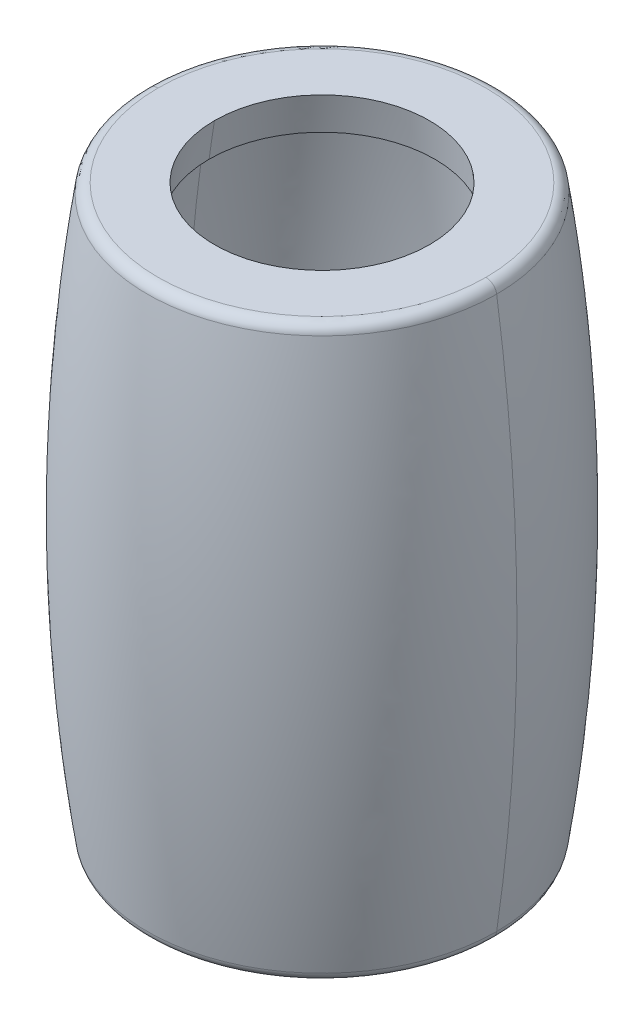
ISO-10303-21;
HEADER;
FILE_DESCRIPTION(('STEP AP214'),'2;1');
FILE_NAME('part.step','',(''),(''),'','','');
FILE_SCHEMA(('AUTOMOTIVE_DESIGN { 1 0 10303 214 1 1 1 1 }'));
ENDSEC;
DATA;
#1=APPLICATION_CONTEXT('core data for automotive mechanical design processes');
#2=APPLICATION_PROTOCOL_DEFINITION('international standard','automotive_design',2000,#1);
#3=PRODUCT_CONTEXT('',#1,'mechanical');
#4=PRODUCT('Part','Part','',(#3));
#5=PRODUCT_RELATED_PRODUCT_CATEGORY('part','',(#4));
#6=PRODUCT_DEFINITION_FORMATION('','',#4);
#7=PRODUCT_DEFINITION_CONTEXT('part definition',#1,'design');
#8=PRODUCT_DEFINITION('design','',#6,#7);
#9=PRODUCT_DEFINITION_SHAPE('','',#8);
#10=(LENGTH_UNIT() NAMED_UNIT(*) SI_UNIT(.MILLI.,.METRE.));
#11=(NAMED_UNIT(*) PLANE_ANGLE_UNIT() SI_UNIT($,.RADIAN.));
#12=(NAMED_UNIT(*) SI_UNIT($,.STERADIAN.) SOLID_ANGLE_UNIT());
#13=UNCERTAINTY_MEASURE_WITH_UNIT(LENGTH_MEASURE(1.E-05),#10,'distance_accuracy_value','');
#14=(GEOMETRIC_REPRESENTATION_CONTEXT(3) GLOBAL_UNCERTAINTY_ASSIGNED_CONTEXT((#13)) GLOBAL_UNIT_ASSIGNED_CONTEXT((#10,
#11,#12)) REPRESENTATION_CONTEXT('',''));
#15=CARTESIAN_POINT('',(0.,0.,0.));
#16=DIRECTION('',(0.,0.,1.));
#17=DIRECTION('',(1.,0.,0.));
#18=AXIS2_PLACEMENT_3D('',#15,#16,#17);
#19=CARTESIAN_POINT('',(0.,-7.6,0.));
#20=DIRECTION('',(0.,-1.,0.));
#21=DIRECTION('',(0.999968235354616,0.,0.00797046308416912));
#22=AXIS2_PLACEMENT_3D('',#19,#20,#21);
#23=TOROIDAL_SURFACE('',#22,4.541707833911,0.3);
#24=CARTESIAN_POINT('',(4.541707833911,-7.6,2.91760365867E-12));
#25=DIRECTION('',(6.42402797623713E-13,0.,-1.));
#26=DIRECTION('',(0.989265332489849,-0.146130427816207,6.35506817183632E-13));
#27=AXIS2_PLACEMENT_3D('',#24,#25,#26);
#28=CIRCLE('',#27,0.3);
#29=CARTESIAN_POINT('',(4.838487428818,-7.643839161107,0.));
#30=VERTEX_POINT('',#29);
#31=CARTESIAN_POINT('',(4.541707637682,-7.9,0.));
#32=VERTEX_POINT('',#31);
#33=EDGE_CURVE('E11',#30,#32,#28,.T.);
#34=ORIENTED_EDGE('',*,*,#33,.T.);
#35=CARTESIAN_POINT('',(0.,-7.9,0.));
#36=DIRECTION('',(0.,1.,0.));
#37=DIRECTION('',(1.,0.,0.));
#38=AXIS2_PLACEMENT_3D('',#35,#36,#37);
#39=CIRCLE('',#38,4.541707637682);
#40=CARTESIAN_POINT('',(-4.541707637682,-7.9,0.));
#41=VERTEX_POINT('',#40);
#42=EDGE_CURVE('E148',#32,#41,#39,.T.);
#43=ORIENTED_EDGE('',*,*,#42,.T.);
#44=CARTESIAN_POINT('',(-4.541707833911,-7.6,-2.917575903094E-12));
#45=DIRECTION('',(-6.42397593453373E-13,0.,1.));
#46=DIRECTION('',(-0.989265332489849,-0.146130427816207,-6.35501668878332E-13));
#47=AXIS2_PLACEMENT_3D('',#44,#45,#46);
#48=CIRCLE('',#47,0.3);
#49=CARTESIAN_POINT('',(-4.838487428818,-7.643839161107,0.));
#50=VERTEX_POINT('',#49);
#51=EDGE_CURVE('E28',#50,#41,#48,.T.);
#52=ORIENTED_EDGE('',*,*,#51,.F.);
#53=CARTESIAN_POINT('',(0.,-7.643839161107,0.));
#54=DIRECTION('',(0.,1.,0.));
#55=DIRECTION('',(1.,0.,0.));
#56=AXIS2_PLACEMENT_3D('',#53,#54,#55);
#57=CIRCLE('',#56,4.838487428818);
#58=EDGE_CURVE('E221',#30,#50,#57,.T.);
#59=ORIENTED_EDGE('',*,*,#58,.F.);
#60=EDGE_LOOP('',(#34,#43,#52,#59));
#61=FACE_BOUND('',#60,.T.);
#62=ADVANCED_FACE('F17',(#61),#23,.T.);
#63=CARTESIAN_POINT('',(0.,-7.6,0.));
#64=DIRECTION('',(0.,-1.,0.));
#65=DIRECTION('',(-0.999968235354616,0.,-0.00797046308416912));
#66=AXIS2_PLACEMENT_3D('',#63,#64,#65);
#67=TOROIDAL_SURFACE('',#66,4.541707833911,0.3);
#68=ORIENTED_EDGE('',*,*,#51,.T.);
#69=CARTESIAN_POINT('',(0.,-7.9,0.));
#70=DIRECTION('',(0.,1.,0.));
#71=DIRECTION('',(-1.,0.,0.));
#72=AXIS2_PLACEMENT_3D('',#69,#70,#71);
#73=CIRCLE('',#72,4.541707637682);
#74=EDGE_CURVE('E144',#41,#32,#73,.T.);
#75=ORIENTED_EDGE('',*,*,#74,.T.);
#76=ORIENTED_EDGE('',*,*,#33,.F.);
#77=CARTESIAN_POINT('',(0.,-7.643839161107,0.));
#78=DIRECTION('',(0.,1.,0.));
#79=DIRECTION('',(-1.,0.,0.));
#80=AXIS2_PLACEMENT_3D('',#77,#78,#79);
#81=CIRCLE('',#80,4.838487428818);
#82=EDGE_CURVE('E228',#50,#30,#81,.T.);
#83=ORIENTED_EDGE('',*,*,#82,.F.);
#84=EDGE_LOOP('',(#68,#75,#76,#83));
#85=FACE_BOUND('',#84,.T.);
#86=ADVANCED_FACE('F233',(#85),#67,.T.);
#87=CARTESIAN_POINT('',(4.783299427244,7.947264384696,-0.3009396918396));
#88=CARTESIAN_POINT('',(5.592934944112,2.669750085723,-0.3518776409801));
#89=CARTESIAN_POINT('',(5.592934946773,-2.669750033268,-0.3518776411475));
#90=CARTESIAN_POINT('',(4.783299435167,-7.947264333052,-0.3009396923381));
#91=CARTESIAN_POINT('',(4.968497291474,7.947264384696,2.642696066141));
#92=CARTESIAN_POINT('',(5.809479950791,2.669750085723,3.090006678403));
#93=CARTESIAN_POINT('',(5.809479953556,-2.669750033268,3.090006679873));
#94=CARTESIAN_POINT('',(4.968497299703,-7.947264333052,2.642696070518));
#95=CARTESIAN_POINT('',(2.949455835332,7.947264384696,4.792756838063));
#96=CARTESIAN_POINT('',(3.448689520373,2.669750085723,5.603993144472));
#97=CARTESIAN_POINT('',(3.448689522014,-2.669750033268,5.603993147139));
#98=CARTESIAN_POINT('',(2.949455840218,-7.947264333052,4.792756846001));
#99=CARTESIAN_POINT('',(0.,7.947264384696,4.792756838063));
#100=CARTESIAN_POINT('',(0.,2.669750085723,5.603993144472));
#101=CARTESIAN_POINT('',(0.,-2.669750033268,5.603993147139));
#102=CARTESIAN_POINT('',(0.,-7.947264333052,4.792756846001));
#103=CARTESIAN_POINT('',(-2.949455835332,7.947264384696,4.792756838063));
#104=CARTESIAN_POINT('',(-3.448689520373,2.669750085723,5.603993144472));
#105=CARTESIAN_POINT('',(-3.448689522014,-2.669750033268,5.603993147139));
#106=CARTESIAN_POINT('',(-2.949455840218,-7.947264333052,4.792756846001));
#107=CARTESIAN_POINT('',(-4.968497291474,7.947264384696,2.642696066141));
#108=CARTESIAN_POINT('',(-5.809479950791,2.669750085723,3.090006678403));
#109=CARTESIAN_POINT('',(-5.809479953556,-2.669750033268,3.090006679873));
#110=CARTESIAN_POINT('',(-4.968497299703,-7.947264333052,2.642696070518));
#111=CARTESIAN_POINT('',(-4.783299427244,7.947264384696,-0.3009396918396));
#112=CARTESIAN_POINT('',(-5.592934944112,2.669750085723,-0.3518776409801));
#113=CARTESIAN_POINT('',(-5.592934946773,-2.669750033268,-0.3518776411475));
#114=CARTESIAN_POINT('',(-4.783299435167,-7.947264333052,-0.3009396923381));
#115=(BOUNDED_SURFACE() B_SPLINE_SURFACE(3,3,((#87,#88,#89,#90),(#91,#92,#93,#94),(#95,#96,#97,
#98),(#99,#100,#101,#102),(#103,#104,#105,#106),(#107,#108,#109,#110),(#111,#112,#113,#114)),
.UNSPECIFIED.,.F.,.F.,.F.) B_SPLINE_SURFACE_WITH_KNOTS((4,3,4),(4,4),(0.,1.,2.),(0.,1.),
.UNSPECIFIED.) GEOMETRIC_REPRESENTATION_ITEM() RATIONAL_B_SPLINE_SURFACE(((1.194194384903,
1.184952181691,1.184952181691,1.194194384903),(0.9430530017022,0.9357544516574,0.9357544516574,
0.9430530017022),(0.9430530017022,0.9357544516574,0.9357544516574,0.9430530017022),
(1.194194384903,1.184952181691,1.184952181691,1.194194384903),(0.9430530017022,0.9357544516574,
0.9357544516574,0.9430530017022),(0.9430530017022,0.9357544516574,0.9357544516574,
0.9430530017022),(1.194194384903,1.184952181691,1.184952181691,1.194194384903))) REPRESENTATION_ITEM('') SURFACE());
#116=CARTESIAN_POINT('',(46.90833333333,0.,0.));
#117=DIRECTION('',(0.,0.,-1.));
#118=DIRECTION('',(-0.989265332489866,-0.146130427816095,0.));
#119=AXIS2_PLACEMENT_3D('',#116,#117,#118);
#120=CIRCLE('',#119,52.30833333333);
#121=CARTESIAN_POINT('',(-4.838487426358,7.64383917776,0.));
#122=VERTEX_POINT('',#121);
#123=EDGE_CURVE('E225',#50,#122,#120,.T.);
#124=CARTESIAN_POINT('',(-46.90833333333,0.,0.));
#125=DIRECTION('',(0.,0.,1.));
#126=DIRECTION('',(0.989265332489866,-0.146130427816095,0.));
#127=AXIS2_PLACEMENT_3D('',#124,#125,#126);
#128=CIRCLE('',#127,52.30833333333);
#129=CARTESIAN_POINT('',(4.838487426358,7.64383917776,0.));
#130=VERTEX_POINT('',#129);
#131=EDGE_CURVE('E218',#30,#130,#128,.T.);
#132=CARTESIAN_POINT('',(0.,7.64383917776,0.));
#133=DIRECTION('',(0.,1.,0.));
#134=DIRECTION('',(-1.,0.,0.));
#135=AXIS2_PLACEMENT_3D('',#132,#133,#134);
#136=CIRCLE('',#135,4.838487426358);
#137=EDGE_CURVE('E170',#122,#130,#136,.T.);
#138=ORIENTED_EDGE('',*,*,#123,.F.);
#139=ORIENTED_EDGE('',*,*,#82,.T.);
#140=ORIENTED_EDGE('',*,*,#131,.T.);
#141=ORIENTED_EDGE('',*,*,#137,.F.);
#142=EDGE_LOOP('',(#138,#139,#140,#141));
#143=FACE_BOUND('',#142,.T.);
#144=ADVANCED_FACE('F19',(#143),#115,.T.);
#145=CARTESIAN_POINT('',(-4.783299427244,7.947264384696,0.3009396918396));
#146=CARTESIAN_POINT('',(-5.592934944112,2.669750085723,0.3518776409801));
#147=CARTESIAN_POINT('',(-5.592934946773,-2.669750033268,0.3518776411475));
#148=CARTESIAN_POINT('',(-4.783299435167,-7.947264333052,0.3009396923381));
#149=CARTESIAN_POINT('',(-4.968497291474,7.947264384696,-2.642696066141));
#150=CARTESIAN_POINT('',(-5.809479950791,2.669750085723,-3.090006678403));
#151=CARTESIAN_POINT('',(-5.809479953556,-2.669750033268,-3.090006679873));
#152=CARTESIAN_POINT('',(-4.968497299703,-7.947264333052,-2.642696070518));
#153=CARTESIAN_POINT('',(-2.949455835332,7.947264384696,-4.792756838063));
#154=CARTESIAN_POINT('',(-3.448689520373,2.669750085723,-5.603993144472));
#155=CARTESIAN_POINT('',(-3.448689522014,-2.669750033268,-5.603993147139));
#156=CARTESIAN_POINT('',(-2.949455840218,-7.947264333052,-4.792756846001));
#157=CARTESIAN_POINT('',(0.,7.947264384696,-4.792756838063));
#158=CARTESIAN_POINT('',(0.,2.669750085723,-5.603993144472));
#159=CARTESIAN_POINT('',(0.,-2.669750033268,-5.603993147139));
#160=CARTESIAN_POINT('',(0.,-7.947264333052,-4.792756846001));
#161=CARTESIAN_POINT('',(2.949455835332,7.947264384696,-4.792756838063));
#162=CARTESIAN_POINT('',(3.448689520373,2.669750085723,-5.603993144472));
#163=CARTESIAN_POINT('',(3.448689522014,-2.669750033268,-5.603993147139));
#164=CARTESIAN_POINT('',(2.949455840218,-7.947264333052,-4.792756846001));
#165=CARTESIAN_POINT('',(4.968497291474,7.947264384696,-2.642696066141));
#166=CARTESIAN_POINT('',(5.809479950791,2.669750085723,-3.090006678403));
#167=CARTESIAN_POINT('',(5.809479953556,-2.669750033268,-3.090006679873));
#168=CARTESIAN_POINT('',(4.968497299703,-7.947264333052,-2.642696070518));
#169=CARTESIAN_POINT('',(4.783299427244,7.947264384696,0.3009396918396));
#170=CARTESIAN_POINT('',(5.592934944112,2.669750085723,0.3518776409801));
#171=CARTESIAN_POINT('',(5.592934946773,-2.669750033268,0.3518776411475));
#172=CARTESIAN_POINT('',(4.783299435167,-7.947264333052,0.3009396923381));
#173=(BOUNDED_SURFACE() B_SPLINE_SURFACE(3,3,((#145,#146,#147,#148),(#149,#150,#151,#152),(#153,
#154,#155,#156),(#157,#158,#159,#160),(#161,#162,#163,#164),(#165,#166,#167,#168),(#169,#170,
#171,#172)),.UNSPECIFIED.,.F.,.F.,.F.) B_SPLINE_SURFACE_WITH_KNOTS((4,3,4),(4,4),(0.,1.,2.),(0.,
1.),.UNSPECIFIED.) GEOMETRIC_REPRESENTATION_ITEM() RATIONAL_B_SPLINE_SURFACE(((1.194194384903,
1.184952181691,1.184952181691,1.194194384903),(0.9430530017022,0.9357544516574,0.9357544516574,
0.9430530017022),(0.9430530017022,0.9357544516574,0.9357544516574,0.9430530017022),
(1.194194384903,1.184952181691,1.184952181691,1.194194384903),(0.9430530017022,0.9357544516574,
0.9357544516574,0.9430530017022),(0.9430530017022,0.9357544516574,0.9357544516574,
0.9430530017022),(1.194194384903,1.184952181691,1.184952181691,1.194194384903))) REPRESENTATION_ITEM('') SURFACE());
#174=CARTESIAN_POINT('',(0.,7.64383917776,0.));
#175=DIRECTION('',(0.,1.,0.));
#176=DIRECTION('',(1.,0.,0.));
#177=AXIS2_PLACEMENT_3D('',#174,#175,#176);
#178=CIRCLE('',#177,4.838487426358);
#179=EDGE_CURVE('E217',#130,#122,#178,.T.);
#180=ORIENTED_EDGE('',*,*,#131,.F.);
#181=ORIENTED_EDGE('',*,*,#58,.T.);
#182=ORIENTED_EDGE('',*,*,#123,.T.);
#183=ORIENTED_EDGE('',*,*,#179,.F.);
#184=EDGE_LOOP('',(#180,#181,#182,#183));
#185=FACE_BOUND('',#184,.T.);
#186=ADVANCED_FACE('F346',(#185),#173,.T.);
#187=CARTESIAN_POINT('',(0.,7.6,0.));
#188=DIRECTION('',(0.,-1.,0.));
#189=DIRECTION('',(0.999930667746694,0.,0.0117753853291699));
#190=AXIS2_PLACEMENT_3D('',#187,#188,#189);
#191=TOROIDAL_SURFACE('',#190,4.541707833911,0.3);
#192=CARTESIAN_POINT('',(4.541707833911,7.6,0.));
#193=DIRECTION('',(0.,0.,-1.));
#194=DIRECTION('',(0.,1.,0.));
#195=AXIS2_PLACEMENT_3D('',#192,#193,#194);
#196=CIRCLE('',#195,0.3);
#197=CARTESIAN_POINT('',(4.541707537485,7.9,0.));
#198=VERTEX_POINT('',#197);
#199=EDGE_CURVE('E213',#198,#130,#196,.T.);
#200=ORIENTED_EDGE('',*,*,#199,.T.);
#201=ORIENTED_EDGE('',*,*,#179,.T.);
#202=CARTESIAN_POINT('',(-4.541707833911,7.6,0.));
#203=DIRECTION('',(0.,0.,1.));
#204=DIRECTION('',(0.,1.,0.));
#205=AXIS2_PLACEMENT_3D('',#202,#203,#204);
#206=CIRCLE('',#205,0.3);
#207=CARTESIAN_POINT('',(-4.541707537485,7.9,0.));
#208=VERTEX_POINT('',#207);
#209=EDGE_CURVE('E166',#208,#122,#206,.T.);
#210=ORIENTED_EDGE('',*,*,#209,.F.);
#211=CARTESIAN_POINT('',(0.,7.9,0.));
#212=DIRECTION('',(0.,1.,0.));
#213=DIRECTION('',(1.,0.,0.));
#214=AXIS2_PLACEMENT_3D('',#211,#212,#213);
#215=CIRCLE('',#214,4.541707537485);
#216=EDGE_CURVE('E200',#198,#208,#215,.T.);
#217=ORIENTED_EDGE('',*,*,#216,.F.);
#218=EDGE_LOOP('',(#200,#201,#210,#217));
#219=FACE_BOUND('',#218,.T.);
#220=ADVANCED_FACE('F251',(#219),#191,.T.);
#221=CARTESIAN_POINT('',(0.,7.6,0.));
#222=DIRECTION('',(0.,-1.,0.));
#223=DIRECTION('',(-0.999930667746694,0.,-0.0117753853291699));
#224=AXIS2_PLACEMENT_3D('',#221,#222,#223);
#225=TOROIDAL_SURFACE('',#224,4.541707833911,0.3);
#226=ORIENTED_EDGE('',*,*,#209,.T.);
#227=ORIENTED_EDGE('',*,*,#137,.T.);
#228=ORIENTED_EDGE('',*,*,#199,.F.);
#229=CARTESIAN_POINT('',(0.,7.9,0.));
#230=DIRECTION('',(0.,1.,0.));
#231=DIRECTION('',(-1.,0.,0.));
#232=AXIS2_PLACEMENT_3D('',#229,#230,#231);
#233=CIRCLE('',#232,4.541707537485);
#234=EDGE_CURVE('E204',#208,#198,#233,.T.);
#235=ORIENTED_EDGE('',*,*,#234,.F.);
#236=EDGE_LOOP('',(#226,#227,#228,#235));
#237=FACE_BOUND('',#236,.T.);
#238=ADVANCED_FACE('F258',(#237),#225,.T.);
#239=CARTESIAN_POINT('',(3.125053601432,6.865391467843,0.1966117074839));
#240=CARTESIAN_POINT('',(3.076179931283,7.222319787047,0.193536836789));
#241=CARTESIAN_POINT('',(3.023497826842,7.578703745196,0.1902223597179));
#242=CARTESIAN_POINT('',(2.967013318701,7.934502546544,0.1866686556832));
#243=CARTESIAN_POINT('',(3.24604817043,6.865391467843,-1.726541895317));
#244=CARTESIAN_POINT('',(3.195282229168,7.222319787047,-1.699539977957));
#245=CARTESIAN_POINT('',(3.140560400187,7.578703745196,-1.670433961853));
#246=CARTESIAN_POINT('',(3.081888947568,7.934502546544,-1.639227178808));
#247=CARTESIAN_POINT('',(1.926956010316,6.865391467843,-3.131232373259));
#248=CARTESIAN_POINT('',(1.896819755246,7.222319787047,-3.082262071405));
#249=CARTESIAN_POINT('',(1.864335161145,7.578703745196,-3.029475805326));
#250=CARTESIAN_POINT('',(1.829505946566,7.934502546544,-2.972879617536));
#251=CARTESIAN_POINT('',(0.,6.865391467843,-3.131232373259));
#252=CARTESIAN_POINT('',(0.,7.222319787047,-3.082262071405));
#253=CARTESIAN_POINT('',(0.,7.578703745196,-3.029475805326));
#254=CARTESIAN_POINT('',(0.,7.934502546544,-2.972879617536));
#255=CARTESIAN_POINT('',(-1.926956010316,6.865391467843,-3.131232373259));
#256=CARTESIAN_POINT('',(-1.896819755246,7.222319787047,-3.082262071405));
#257=CARTESIAN_POINT('',(-1.864335161145,7.578703745196,-3.029475805326));
#258=CARTESIAN_POINT('',(-1.829505946566,7.934502546544,-2.972879617536));
#259=CARTESIAN_POINT('',(-3.24604817043,6.865391467843,-1.726541895317));
#260=CARTESIAN_POINT('',(-3.195282229168,7.222319787047,-1.699539977957));
#261=CARTESIAN_POINT('',(-3.140560400187,7.578703745196,-1.670433961853));
#262=CARTESIAN_POINT('',(-3.081888947568,7.934502546544,-1.639227178808));
#263=CARTESIAN_POINT('',(-3.125053601432,6.865391467843,0.1966117074839));
#264=CARTESIAN_POINT('',(-3.076179931283,7.222319787047,0.193536836789));
#265=CARTESIAN_POINT('',(-3.023497826842,7.578703745196,0.1902223597179));
#266=CARTESIAN_POINT('',(-2.967013318701,7.934502546544,0.1866686556832));
#267=(BOUNDED_SURFACE() B_SPLINE_SURFACE(3,3,((#239,#240,#241,#242),(#243,#244,#245,#246),(#247,
#248,#249,#250),(#251,#252,#253,#254),(#255,#256,#257,#258),(#259,#260,#261,#262),(#263,#264,
#265,#266)),.UNSPECIFIED.,.F.,.F.,.F.) B_SPLINE_SURFACE_WITH_KNOTS((4,3,4),(4,4),(0.,1.,2.),(0.,
1.),.UNSPECIFIED.) GEOMETRIC_REPRESENTATION_ITEM() RATIONAL_B_SPLINE_SURFACE(((1.187296710354,
1.187251406541,1.187251406541,1.187296710354),(0.9376059214194,0.937570145085,0.937570145085,
0.9376059214194),(0.9376059214194,0.937570145085,0.937570145085,0.9376059214194),
(1.187296710354,1.187251406541,1.187251406541,1.187296710354),(0.9376059214194,0.937570145085,
0.937570145085,0.9376059214194),(0.9376059214194,0.937570145085,0.937570145085,0.9376059214194),
(1.187296710354,1.187251406541,1.187251406541,1.187296710354))) REPRESENTATION_ITEM('') SURFACE());
#268=CARTESIAN_POINT('',(46.90833333333,0.,0.));
#269=DIRECTION('',(0.,0.,-1.));
#270=DIRECTION('',(-0.9906247532828,0.1366111202772,0.));
#271=AXIS2_PLACEMENT_3D('',#268,#269,#270);
#272=CIRCLE('',#271,50.50833333333);
#273=CARTESIAN_POINT('',(-3.126471913726,6.9,0.));
#274=VERTEX_POINT('',#273);
#275=CARTESIAN_POINT('',(-2.978355633876,7.9,0.));
#276=VERTEX_POINT('',#275);
#277=EDGE_CURVE('E192',#274,#276,#272,.T.);
#278=CARTESIAN_POINT('',(0.,6.9,0.));
#279=DIRECTION('',(0.,-1.,0.));
#280=DIRECTION('',(-1.,0.,0.));
#281=AXIS2_PLACEMENT_3D('',#278,#279,#280);
#282=CIRCLE('',#281,3.126471913726);
#283=CARTESIAN_POINT('',(3.126471913726,6.9,0.));
#284=VERTEX_POINT('',#283);
#285=EDGE_CURVE('E153',#274,#284,#282,.T.);
#286=CARTESIAN_POINT('',(-46.90833333333,0.,0.));
#287=DIRECTION('',(0.,0.,1.));
#288=DIRECTION('',(0.9906247532828,0.1366111202772,0.));
#289=AXIS2_PLACEMENT_3D('',#286,#287,#288);
#290=CIRCLE('',#289,50.50833333333);
#291=CARTESIAN_POINT('',(2.978355633876,7.9,0.));
#292=VERTEX_POINT('',#291);
#293=EDGE_CURVE('E188',#284,#292,#290,.T.);
#294=CARTESIAN_POINT('',(0.,7.9,0.));
#295=DIRECTION('',(0.,1.,0.));
#296=DIRECTION('',(1.,0.,0.));
#297=AXIS2_PLACEMENT_3D('',#294,#295,#296);
#298=CIRCLE('',#297,2.978355633876);
#299=EDGE_CURVE('E171',#292,#276,#298,.T.);
#300=ORIENTED_EDGE('',*,*,#277,.F.);
#301=ORIENTED_EDGE('',*,*,#285,.T.);
#302=ORIENTED_EDGE('',*,*,#293,.T.);
#303=ORIENTED_EDGE('',*,*,#299,.T.);
#304=EDGE_LOOP('',(#300,#301,#302,#303));
#305=FACE_BOUND('',#304,.T.);
#306=ADVANCED_FACE('F263',(#305),#267,.F.);
#307=CARTESIAN_POINT('',(0.,7.9,0.));
#308=DIRECTION('',(0.,-1.,0.));
#309=DIRECTION('',(0.,0.,-1.));
#310=AXIS2_PLACEMENT_3D('',#307,#308,#309);
#311=PLANE('',#310);
#312=ORIENTED_EDGE('',*,*,#299,.F.);
#313=CARTESIAN_POINT('',(0.,7.9,0.));
#314=DIRECTION('',(0.,1.,0.));
#315=DIRECTION('',(-1.,0.,0.));
#316=AXIS2_PLACEMENT_3D('',#313,#314,#315);
#317=CIRCLE('',#316,2.978355633876);
#318=EDGE_CURVE('E196',#276,#292,#317,.T.);
#319=ORIENTED_EDGE('',*,*,#318,.F.);
#320=EDGE_LOOP('',(#312,#319));
#321=FACE_BOUND('',#320,.T.);
#322=ORIENTED_EDGE('',*,*,#216,.T.);
#323=ORIENTED_EDGE('',*,*,#234,.T.);
#324=EDGE_LOOP('',(#322,#323));
#325=FACE_BOUND('',#324,.T.);
#326=ADVANCED_FACE('F260',(#321,#325),#311,.F.);
#327=CARTESIAN_POINT('',(-3.125053601432,6.865391467843,-0.1966117074839));
#328=CARTESIAN_POINT('',(-3.076179931283,7.222319787047,-0.193536836789));
#329=CARTESIAN_POINT('',(-3.023497826842,7.578703745196,-0.1902223597179));
#330=CARTESIAN_POINT('',(-2.967013318701,7.934502546544,-0.1866686556832));
#331=CARTESIAN_POINT('',(-3.24604817043,6.865391467843,1.726541895317));
#332=CARTESIAN_POINT('',(-3.195282229168,7.222319787047,1.699539977957));
#333=CARTESIAN_POINT('',(-3.140560400187,7.578703745196,1.670433961853));
#334=CARTESIAN_POINT('',(-3.081888947568,7.934502546544,1.639227178808));
#335=CARTESIAN_POINT('',(-1.926956010316,6.865391467843,3.131232373259));
#336=CARTESIAN_POINT('',(-1.896819755246,7.222319787047,3.082262071405));
#337=CARTESIAN_POINT('',(-1.864335161145,7.578703745196,3.029475805326));
#338=CARTESIAN_POINT('',(-1.829505946566,7.934502546544,2.972879617536));
#339=CARTESIAN_POINT('',(0.,6.865391467843,3.131232373259));
#340=CARTESIAN_POINT('',(0.,7.222319787047,3.082262071405));
#341=CARTESIAN_POINT('',(0.,7.578703745196,3.029475805326));
#342=CARTESIAN_POINT('',(0.,7.934502546544,2.972879617536));
#343=CARTESIAN_POINT('',(1.926956010316,6.865391467843,3.131232373259));
#344=CARTESIAN_POINT('',(1.896819755246,7.222319787047,3.082262071405));
#345=CARTESIAN_POINT('',(1.864335161145,7.578703745196,3.029475805326));
#346=CARTESIAN_POINT('',(1.829505946566,7.934502546544,2.972879617536));
#347=CARTESIAN_POINT('',(3.24604817043,6.865391467843,1.726541895317));
#348=CARTESIAN_POINT('',(3.195282229168,7.222319787047,1.699539977957));
#349=CARTESIAN_POINT('',(3.140560400187,7.578703745196,1.670433961853));
#350=CARTESIAN_POINT('',(3.081888947568,7.934502546544,1.639227178808));
#351=CARTESIAN_POINT('',(3.125053601432,6.865391467843,-0.1966117074839));
#352=CARTESIAN_POINT('',(3.076179931283,7.222319787047,-0.193536836789));
#353=CARTESIAN_POINT('',(3.023497826842,7.578703745196,-0.1902223597179));
#354=CARTESIAN_POINT('',(2.967013318701,7.934502546544,-0.1866686556832));
#355=(BOUNDED_SURFACE() B_SPLINE_SURFACE(3,3,((#327,#328,#329,#330),(#331,#332,#333,#334),(#335,
#336,#337,#338),(#339,#340,#341,#342),(#343,#344,#345,#346),(#347,#348,#349,#350),(#351,#352,
#353,#354)),.UNSPECIFIED.,.F.,.F.,.F.) B_SPLINE_SURFACE_WITH_KNOTS((4,3,4),(4,4),(0.,1.,2.),(0.,
1.),.UNSPECIFIED.) GEOMETRIC_REPRESENTATION_ITEM() RATIONAL_B_SPLINE_SURFACE(((1.187296710354,
1.187251406541,1.187251406541,1.187296710354),(0.9376059214194,0.937570145085,0.937570145085,
0.9376059214194),(0.9376059214194,0.937570145085,0.937570145085,0.9376059214194),
(1.187296710354,1.187251406541,1.187251406541,1.187296710354),(0.9376059214194,0.937570145085,
0.937570145085,0.9376059214194),(0.9376059214194,0.937570145085,0.937570145085,0.9376059214194),
(1.187296710354,1.187251406541,1.187251406541,1.187296710354))) REPRESENTATION_ITEM('') SURFACE());
#356=CARTESIAN_POINT('',(0.,6.9,0.));
#357=DIRECTION('',(0.,1.,0.));
#358=DIRECTION('',(-1.,0.,0.));
#359=AXIS2_PLACEMENT_3D('',#356,#357,#358);
#360=CIRCLE('',#359,3.126471913726);
#361=EDGE_CURVE('E157',#274,#284,#360,.T.);
#362=ORIENTED_EDGE('',*,*,#293,.F.);
#363=ORIENTED_EDGE('',*,*,#361,.F.);
#364=ORIENTED_EDGE('',*,*,#277,.T.);
#365=ORIENTED_EDGE('',*,*,#318,.T.);
#366=EDGE_LOOP('',(#362,#363,#364,#365));
#367=FACE_BOUND('',#366,.T.);
#368=ADVANCED_FACE('F262',(#367),#355,.F.);
#369=CARTESIAN_POINT('',(0.,6.9,0.));
#370=DIRECTION('',(0.,1.,0.));
#371=DIRECTION('',(1.,0.,0.));
#372=AXIS2_PLACEMENT_3D('',#369,#370,#371);
#373=PLANE('',#372);
#374=ORIENTED_EDGE('',*,*,#285,.F.);
#375=ORIENTED_EDGE('',*,*,#361,.T.);
#376=EDGE_LOOP('',(#374,#375));
#377=FACE_BOUND('',#376,.T.);
#378=CARTESIAN_POINT('',(0.,6.9,0.));
#379=DIRECTION('',(0.,1.,0.));
#380=DIRECTION('',(-1.,0.,0.));
#381=AXIS2_PLACEMENT_3D('',#378,#379,#380);
#382=CIRCLE('',#381,3.328357137322);
#383=CARTESIAN_POINT('',(-3.328357137322,6.9,0.));
#384=VERTEX_POINT('',#383);
#385=CARTESIAN_POINT('',(3.328357137322,6.9,0.));
#386=VERTEX_POINT('',#385);
#387=EDGE_CURVE('E158',#384,#386,#382,.T.);
#388=ORIENTED_EDGE('',*,*,#387,.F.);
#389=CARTESIAN_POINT('',(0.,6.9,0.));
#390=DIRECTION('',(0.,-1.,0.));
#391=DIRECTION('',(-1.,0.,0.));
#392=AXIS2_PLACEMENT_3D('',#389,#390,#391);
#393=CIRCLE('',#392,3.328357137322);
#394=EDGE_CURVE('E174',#384,#386,#393,.T.);
#395=ORIENTED_EDGE('',*,*,#394,.T.);
#396=EDGE_LOOP('',(#388,#395));
#397=FACE_BOUND('',#396,.T.);
#398=ADVANCED_FACE('F272',(#377,#397),#373,.F.);
#399=CARTESIAN_POINT('',(-3.283443788849,-7.174179600663,-0.2065767734215));
#400=CARTESIAN_POINT('',(-3.963333066077,-2.407537805303,-0.2493517810676));
#401=CARTESIAN_POINT('',(-3.963333066077,2.407537805303,-0.2493517810676));
#402=CARTESIAN_POINT('',(-3.283443788849,7.174179600663,-0.2065767734215));
#403=CARTESIAN_POINT('',(-3.410570845446,-7.174179600663,1.814049928541));
#404=CARTESIAN_POINT('',(-4.116783802379,-2.407537805303,2.189677828419));
#405=CARTESIAN_POINT('',(-4.116783802379,2.407537805303,2.189677828419));
#406=CARTESIAN_POINT('',(-3.410570845446,7.174179600663,1.814049928541));
#407=CARTESIAN_POINT('',(-2.024621830665,-7.174179600663,3.289935725489));
#408=CARTESIAN_POINT('',(-2.44385199315,-2.407537805303,3.971169261487));
#409=CARTESIAN_POINT('',(-2.44385199315,2.407537805303,3.971169261487));
#410=CARTESIAN_POINT('',(-2.024621830665,7.174179600663,3.289935725489));
#411=CARTESIAN_POINT('',(0.,-7.174179600663,3.289935725489));
#412=CARTESIAN_POINT('',(0.,-2.407537805303,3.971169261487));
#413=CARTESIAN_POINT('',(0.,2.407537805303,3.971169261487));
#414=CARTESIAN_POINT('',(0.,7.174179600663,3.289935725489));
#415=CARTESIAN_POINT('',(2.024621830665,-7.174179600663,3.289935725489));
#416=CARTESIAN_POINT('',(2.44385199315,-2.407537805303,3.971169261487));
#417=CARTESIAN_POINT('',(2.44385199315,2.407537805303,3.971169261487));
#418=CARTESIAN_POINT('',(2.024621830665,7.174179600663,3.289935725489));
#419=CARTESIAN_POINT('',(3.410570845446,-7.174179600663,1.814049928541));
#420=CARTESIAN_POINT('',(4.116783802379,-2.407537805303,2.189677828419));
#421=CARTESIAN_POINT('',(4.116783802379,2.407537805303,2.189677828419));
#422=CARTESIAN_POINT('',(3.410570845446,7.174179600663,1.814049928541));
#423=CARTESIAN_POINT('',(3.283443788849,-7.174179600663,-0.2065767734215));
#424=CARTESIAN_POINT('',(3.963333066077,-2.407537805303,-0.2493517810676));
#425=CARTESIAN_POINT('',(3.963333066077,2.407537805303,-0.2493517810676));
#426=CARTESIAN_POINT('',(3.283443788849,7.174179600663,-0.2065767734215));
#427=(BOUNDED_SURFACE() B_SPLINE_SURFACE(3,3,((#399,#400,#401,#402),(#403,#404,#405,#406),(#407,
#408,#409,#410),(#411,#412,#413,#414),(#415,#416,#417,#418),(#419,#420,#421,#422),(#423,#424,
#425,#426)),.UNSPECIFIED.,.F.,.F.,.F.) B_SPLINE_SURFACE_WITH_KNOTS((4,3,4),(4,4),(0.,1.,2.),(0.,
1.),.UNSPECIFIED.) GEOMETRIC_REPRESENTATION_ITEM() RATIONAL_B_SPLINE_SURFACE(((1.193264126753,
1.185262267741,1.185262267741,1.193264126753),(0.9423183786361,0.9359993260128,0.9359993260128,
0.9423183786361),(0.9423183786361,0.9359993260128,0.9359993260128,0.9423183786361),
(1.193264126753,1.185262267741,1.185262267741,1.193264126753),(0.9423183786361,0.9359993260128,
0.9359993260128,0.9423183786361),(0.9423183786361,0.9359993260128,0.9359993260128,
0.9423183786361),(1.193264126753,1.185262267741,1.185262267741,1.193264126753))) REPRESENTATION_ITEM('') SURFACE());
#428=CARTESIAN_POINT('',(-46.90833333333,0.,0.));
#429=DIRECTION('',(0.,0.,1.));
#430=DIRECTION('',(0.990698908213425,-0.136072308956403,0.));
#431=AXIS2_PLACEMENT_3D('',#428,#429,#430);
#432=CIRCLE('',#431,50.70833333333);
#433=CARTESIAN_POINT('',(3.328357137322,-6.9,0.));
#434=VERTEX_POINT('',#433);
#435=EDGE_CURVE('E179',#434,#386,#432,.T.);
#436=CARTESIAN_POINT('',(0.,-6.9,0.));
#437=DIRECTION('',(0.,1.,0.));
#438=DIRECTION('',(-1.,0.,0.));
#439=AXIS2_PLACEMENT_3D('',#436,#437,#438);
#440=CIRCLE('',#439,3.328357137322);
#441=CARTESIAN_POINT('',(-3.328357137322,-6.9,0.));
#442=VERTEX_POINT('',#441);
#443=EDGE_CURVE('E159',#442,#434,#440,.T.);
#444=CARTESIAN_POINT('',(46.90833333333,0.,0.));
#445=DIRECTION('',(0.,0.,-1.));
#446=DIRECTION('',(-0.990698908213425,-0.136072308956403,0.));
#447=AXIS2_PLACEMENT_3D('',#444,#445,#446);
#448=CIRCLE('',#447,50.70833333333);
#449=EDGE_CURVE('E178',#442,#384,#448,.T.);
#450=ORIENTED_EDGE('',*,*,#387,.T.);
#451=ORIENTED_EDGE('',*,*,#435,.F.);
#452=ORIENTED_EDGE('',*,*,#443,.F.);
#453=ORIENTED_EDGE('',*,*,#449,.T.);
#454=EDGE_LOOP('',(#450,#451,#452,#453));
#455=FACE_BOUND('',#454,.T.);
#456=ADVANCED_FACE('F287',(#455),#427,.F.);
#457=CARTESIAN_POINT('',(3.283443788849,-7.174179600663,0.2065767734215));
#458=CARTESIAN_POINT('',(3.963333066077,-2.407537805303,0.2493517810676));
#459=CARTESIAN_POINT('',(3.963333066077,2.407537805303,0.2493517810676));
#460=CARTESIAN_POINT('',(3.283443788849,7.174179600663,0.2065767734215));
#461=CARTESIAN_POINT('',(3.410570845446,-7.174179600663,-1.814049928541));
#462=CARTESIAN_POINT('',(4.116783802379,-2.407537805303,-2.189677828419));
#463=CARTESIAN_POINT('',(4.116783802379,2.407537805303,-2.189677828419));
#464=CARTESIAN_POINT('',(3.410570845446,7.174179600663,-1.814049928541));
#465=CARTESIAN_POINT('',(2.024621830665,-7.174179600663,-3.289935725489));
#466=CARTESIAN_POINT('',(2.44385199315,-2.407537805303,-3.971169261487));
#467=CARTESIAN_POINT('',(2.44385199315,2.407537805303,-3.971169261487));
#468=CARTESIAN_POINT('',(2.024621830665,7.174179600663,-3.289935725489));
#469=CARTESIAN_POINT('',(0.,-7.174179600663,-3.289935725489));
#470=CARTESIAN_POINT('',(0.,-2.407537805303,-3.971169261487));
#471=CARTESIAN_POINT('',(0.,2.407537805303,-3.971169261487));
#472=CARTESIAN_POINT('',(0.,7.174179600663,-3.289935725489));
#473=CARTESIAN_POINT('',(-2.024621830665,-7.174179600663,-3.289935725489));
#474=CARTESIAN_POINT('',(-2.44385199315,-2.407537805303,-3.971169261487));
#475=CARTESIAN_POINT('',(-2.44385199315,2.407537805303,-3.971169261487));
#476=CARTESIAN_POINT('',(-2.024621830665,7.174179600663,-3.289935725489));
#477=CARTESIAN_POINT('',(-3.410570845446,-7.174179600663,-1.814049928541));
#478=CARTESIAN_POINT('',(-4.116783802379,-2.407537805303,-2.189677828419));
#479=CARTESIAN_POINT('',(-4.116783802379,2.407537805303,-2.189677828419));
#480=CARTESIAN_POINT('',(-3.410570845446,7.174179600663,-1.814049928541));
#481=CARTESIAN_POINT('',(-3.283443788849,-7.174179600663,0.2065767734215));
#482=CARTESIAN_POINT('',(-3.963333066077,-2.407537805303,0.2493517810676));
#483=CARTESIAN_POINT('',(-3.963333066077,2.407537805303,0.2493517810676));
#484=CARTESIAN_POINT('',(-3.283443788849,7.174179600663,0.2065767734215));
#485=(BOUNDED_SURFACE() B_SPLINE_SURFACE(3,3,((#457,#458,#459,#460),(#461,#462,#463,#464),(#465,
#466,#467,#468),(#469,#470,#471,#472),(#473,#474,#475,#476),(#477,#478,#479,#480),(#481,#482,
#483,#484)),.UNSPECIFIED.,.F.,.F.,.F.) B_SPLINE_SURFACE_WITH_KNOTS((4,3,4),(4,4),(0.,1.,2.),(0.,
1.),.UNSPECIFIED.) GEOMETRIC_REPRESENTATION_ITEM() RATIONAL_B_SPLINE_SURFACE(((1.193264126753,
1.185262267741,1.185262267741,1.193264126753),(0.9423183786361,0.9359993260128,0.9359993260128,
0.9423183786361),(0.9423183786361,0.9359993260128,0.9359993260128,0.9423183786361),
(1.193264126753,1.185262267741,1.185262267741,1.193264126753),(0.9423183786361,0.9359993260128,
0.9359993260128,0.9423183786361),(0.9423183786361,0.9359993260128,0.9359993260128,
0.9423183786361),(1.193264126753,1.185262267741,1.185262267741,1.193264126753))) REPRESENTATION_ITEM('') SURFACE());
#486=CARTESIAN_POINT('',(0.,-6.9,0.));
#487=DIRECTION('',(0.,-1.,0.));
#488=DIRECTION('',(-1.,0.,0.));
#489=AXIS2_PLACEMENT_3D('',#486,#487,#488);
#490=CIRCLE('',#489,3.328357137322);
#491=EDGE_CURVE('E163',#442,#434,#490,.T.);
#492=ORIENTED_EDGE('',*,*,#491,.T.);
#493=ORIENTED_EDGE('',*,*,#435,.T.);
#494=ORIENTED_EDGE('',*,*,#394,.F.);
#495=ORIENTED_EDGE('',*,*,#449,.F.);
#496=EDGE_LOOP('',(#492,#493,#494,#495));
#497=FACE_BOUND('',#496,.T.);
#498=ADVANCED_FACE('F297',(#497),#485,.F.);
#499=CARTESIAN_POINT('',(0.,-6.9,0.));
#500=DIRECTION('',(0.,1.,0.));
#501=DIRECTION('',(1.,0.,0.));
#502=AXIS2_PLACEMENT_3D('',#499,#500,#501);
#503=PLANE('',#502);
#504=CARTESIAN_POINT('',(0.,-6.9,0.));
#505=DIRECTION('',(0.,-1.,0.));
#506=DIRECTION('',(-1.,0.,0.));
#507=AXIS2_PLACEMENT_3D('',#504,#505,#506);
#508=CIRCLE('',#507,3.126471913726);
#509=CARTESIAN_POINT('',(-3.126471913726,-6.9,0.));
#510=VERTEX_POINT('',#509);
#511=CARTESIAN_POINT('',(3.126471913726,-6.9,0.));
#512=VERTEX_POINT('',#511);
#513=EDGE_CURVE('E133',#510,#512,#508,.T.);
#514=ORIENTED_EDGE('',*,*,#513,.T.);
#515=CARTESIAN_POINT('',(0.,-6.9,0.));
#516=DIRECTION('',(0.,1.,0.));
#517=DIRECTION('',(-1.,0.,0.));
#518=AXIS2_PLACEMENT_3D('',#515,#516,#517);
#519=CIRCLE('',#518,3.126471913726);
#520=EDGE_CURVE('E129',#510,#512,#519,.T.);
#521=ORIENTED_EDGE('',*,*,#520,.F.);
#522=EDGE_LOOP('',(#514,#521));
#523=FACE_BOUND('',#522,.T.);
#524=ORIENTED_EDGE('',*,*,#443,.T.);
#525=ORIENTED_EDGE('',*,*,#491,.F.);
#526=EDGE_LOOP('',(#524,#525));
#527=FACE_BOUND('',#526,.T.);
#528=ADVANCED_FACE('F308',(#523,#527),#503,.T.);
#529=CARTESIAN_POINT('',(2.967013318701,-7.934502546544,0.1866686556832));
#530=CARTESIAN_POINT('',(3.023497826842,-7.578703745196,0.1902223597179));
#531=CARTESIAN_POINT('',(3.076179931283,-7.222319787047,0.193536836789));
#532=CARTESIAN_POINT('',(3.125053601432,-6.865391467843,0.1966117074839));
#533=CARTESIAN_POINT('',(3.081888947568,-7.934502546544,-1.639227178808));
#534=CARTESIAN_POINT('',(3.140560400187,-7.578703745196,-1.670433961853));
#535=CARTESIAN_POINT('',(3.195282229168,-7.222319787047,-1.699539977957));
#536=CARTESIAN_POINT('',(3.24604817043,-6.865391467843,-1.726541895317));
#537=CARTESIAN_POINT('',(1.829505946566,-7.934502546544,-2.972879617536));
#538=CARTESIAN_POINT('',(1.864335161145,-7.578703745196,-3.029475805326));
#539=CARTESIAN_POINT('',(1.896819755246,-7.222319787047,-3.082262071405));
#540=CARTESIAN_POINT('',(1.926956010316,-6.865391467843,-3.131232373259));
#541=CARTESIAN_POINT('',(0.,-7.934502546544,-2.972879617536));
#542=CARTESIAN_POINT('',(0.,-7.578703745196,-3.029475805326));
#543=CARTESIAN_POINT('',(0.,-7.222319787047,-3.082262071405));
#544=CARTESIAN_POINT('',(0.,-6.865391467843,-3.131232373259));
#545=CARTESIAN_POINT('',(-1.829505946566,-7.934502546544,-2.972879617536));
#546=CARTESIAN_POINT('',(-1.864335161145,-7.578703745196,-3.029475805326));
#547=CARTESIAN_POINT('',(-1.896819755246,-7.222319787047,-3.082262071405));
#548=CARTESIAN_POINT('',(-1.926956010316,-6.865391467843,-3.131232373259));
#549=CARTESIAN_POINT('',(-3.081888947568,-7.934502546544,-1.639227178808));
#550=CARTESIAN_POINT('',(-3.140560400187,-7.578703745196,-1.670433961853));
#551=CARTESIAN_POINT('',(-3.195282229168,-7.222319787047,-1.699539977957));
#552=CARTESIAN_POINT('',(-3.24604817043,-6.865391467843,-1.726541895317));
#553=CARTESIAN_POINT('',(-2.967013318701,-7.934502546544,0.1866686556832));
#554=CARTESIAN_POINT('',(-3.023497826842,-7.578703745196,0.1902223597179));
#555=CARTESIAN_POINT('',(-3.076179931283,-7.222319787047,0.193536836789));
#556=CARTESIAN_POINT('',(-3.125053601432,-6.865391467843,0.1966117074839));
#557=(BOUNDED_SURFACE() B_SPLINE_SURFACE(3,3,((#529,#530,#531,#532),(#533,#534,#535,#536),(#537,
#538,#539,#540),(#541,#542,#543,#544),(#545,#546,#547,#548),(#549,#550,#551,#552),(#553,#554,
#555,#556)),.UNSPECIFIED.,.F.,.F.,.F.) B_SPLINE_SURFACE_WITH_KNOTS((4,3,4),(4,4),(0.,1.,2.),(0.,
1.),.UNSPECIFIED.) GEOMETRIC_REPRESENTATION_ITEM() RATIONAL_B_SPLINE_SURFACE(((1.187296710354,
1.187251406541,1.187251406541,1.187296710354),(0.9376059214194,0.937570145085,0.937570145085,
0.9376059214194),(0.9376059214194,0.937570145085,0.937570145085,0.9376059214194),
(1.187296710354,1.187251406541,1.187251406541,1.187296710354),(0.9376059214194,0.937570145085,
0.937570145085,0.9376059214194),(0.9376059214194,0.937570145085,0.937570145085,0.9376059214194),
(1.187296710354,1.187251406541,1.187251406541,1.187296710354))) REPRESENTATION_ITEM('') SURFACE());
#558=CARTESIAN_POINT('',(-46.90833333333,0.,0.));
#559=DIRECTION('',(0.,0.,1.));
#560=DIRECTION('',(0.987692241555053,-0.156409833360808,0.));
#561=AXIS2_PLACEMENT_3D('',#558,#559,#560);
#562=CIRCLE('',#561,50.50833333333);
#563=CARTESIAN_POINT('',(2.978355633876,-7.9,0.));
#564=VERTEX_POINT('',#563);
#565=EDGE_CURVE('E122',#564,#512,#562,.T.);
#566=CARTESIAN_POINT('',(46.90833333333,0.,0.));
#567=DIRECTION('',(0.,0.,-1.));
#568=DIRECTION('',(-0.987692241555053,-0.156409833360808,0.));
#569=AXIS2_PLACEMENT_3D('',#566,#567,#568);
#570=CIRCLE('',#569,50.50833333333);
#571=CARTESIAN_POINT('',(-2.978355633876,-7.9,0.));
#572=VERTEX_POINT('',#571);
#573=EDGE_CURVE('E140',#572,#510,#570,.T.);
#574=CARTESIAN_POINT('',(0.,-7.9,0.));
#575=DIRECTION('',(0.,1.,0.));
#576=DIRECTION('',(1.,0.,0.));
#577=AXIS2_PLACEMENT_3D('',#574,#575,#576);
#578=CIRCLE('',#577,2.978355633876);
#579=EDGE_CURVE('E138',#564,#572,#578,.T.);
#580=ORIENTED_EDGE('',*,*,#565,.T.);
#581=ORIENTED_EDGE('',*,*,#513,.F.);
#582=ORIENTED_EDGE('',*,*,#573,.F.);
#583=ORIENTED_EDGE('',*,*,#579,.F.);
#584=EDGE_LOOP('',(#580,#581,#582,#583));
#585=FACE_BOUND('',#584,.T.);
#586=ADVANCED_FACE('F142',(#585),#557,.F.);
#587=CARTESIAN_POINT('',(-2.967013318701,-7.934502546544,-0.1866686556832));
#588=CARTESIAN_POINT('',(-3.023497826842,-7.578703745196,-0.1902223597179));
#589=CARTESIAN_POINT('',(-3.076179931283,-7.222319787047,-0.193536836789));
#590=CARTESIAN_POINT('',(-3.125053601432,-6.865391467843,-0.1966117074839));
#591=CARTESIAN_POINT('',(-3.081888947568,-7.934502546544,1.639227178808));
#592=CARTESIAN_POINT('',(-3.140560400187,-7.578703745196,1.670433961853));
#593=CARTESIAN_POINT('',(-3.195282229168,-7.222319787047,1.699539977957));
#594=CARTESIAN_POINT('',(-3.24604817043,-6.865391467843,1.726541895317));
#595=CARTESIAN_POINT('',(-1.829505946566,-7.934502546544,2.972879617536));
#596=CARTESIAN_POINT('',(-1.864335161145,-7.578703745196,3.029475805326));
#597=CARTESIAN_POINT('',(-1.896819755246,-7.222319787047,3.082262071405));
#598=CARTESIAN_POINT('',(-1.926956010316,-6.865391467843,3.131232373259));
#599=CARTESIAN_POINT('',(0.,-7.934502546544,2.972879617536));
#600=CARTESIAN_POINT('',(0.,-7.578703745196,3.029475805326));
#601=CARTESIAN_POINT('',(0.,-7.222319787047,3.082262071405));
#602=CARTESIAN_POINT('',(0.,-6.865391467843,3.131232373259));
#603=CARTESIAN_POINT('',(1.829505946566,-7.934502546544,2.972879617536));
#604=CARTESIAN_POINT('',(1.864335161145,-7.578703745196,3.029475805326));
#605=CARTESIAN_POINT('',(1.896819755246,-7.222319787047,3.082262071405));
#606=CARTESIAN_POINT('',(1.926956010316,-6.865391467843,3.131232373259));
#607=CARTESIAN_POINT('',(3.081888947568,-7.934502546544,1.639227178808));
#608=CARTESIAN_POINT('',(3.140560400187,-7.578703745196,1.670433961853));
#609=CARTESIAN_POINT('',(3.195282229168,-7.222319787047,1.699539977957));
#610=CARTESIAN_POINT('',(3.24604817043,-6.865391467843,1.726541895317));
#611=CARTESIAN_POINT('',(2.967013318701,-7.934502546544,-0.1866686556832));
#612=CARTESIAN_POINT('',(3.023497826842,-7.578703745196,-0.1902223597179));
#613=CARTESIAN_POINT('',(3.076179931283,-7.222319787047,-0.193536836789));
#614=CARTESIAN_POINT('',(3.125053601432,-6.865391467843,-0.1966117074839));
#615=(BOUNDED_SURFACE() B_SPLINE_SURFACE(3,3,((#587,#588,#589,#590),(#591,#592,#593,#594),(#595,
#596,#597,#598),(#599,#600,#601,#602),(#603,#604,#605,#606),(#607,#608,#609,#610),(#611,#612,
#613,#614)),.UNSPECIFIED.,.F.,.F.,.F.) B_SPLINE_SURFACE_WITH_KNOTS((4,3,4),(4,4),(0.,1.,2.),(0.,
1.),.UNSPECIFIED.) GEOMETRIC_REPRESENTATION_ITEM() RATIONAL_B_SPLINE_SURFACE(((1.187296710354,
1.187251406541,1.187251406541,1.187296710354),(0.9376059214194,0.937570145085,0.937570145085,
0.9376059214194),(0.9376059214194,0.937570145085,0.937570145085,0.9376059214194),
(1.187296710354,1.187251406541,1.187251406541,1.187296710354),(0.9376059214194,0.937570145085,
0.937570145085,0.9376059214194),(0.9376059214194,0.937570145085,0.937570145085,0.9376059214194),
(1.187296710354,1.187251406541,1.187251406541,1.187296710354))) REPRESENTATION_ITEM('') SURFACE());
#616=CARTESIAN_POINT('',(0.,-7.9,0.));
#617=DIRECTION('',(0.,1.,0.));
#618=DIRECTION('',(-1.,0.,0.));
#619=AXIS2_PLACEMENT_3D('',#616,#617,#618);
#620=CIRCLE('',#619,2.978355633876);
#621=EDGE_CURVE('E126',#572,#564,#620,.T.);
#622=ORIENTED_EDGE('',*,*,#573,.T.);
#623=ORIENTED_EDGE('',*,*,#520,.T.);
#624=ORIENTED_EDGE('',*,*,#565,.F.);
#625=ORIENTED_EDGE('',*,*,#621,.F.);
#626=EDGE_LOOP('',(#622,#623,#624,#625));
#627=FACE_BOUND('',#626,.T.);
#628=ADVANCED_FACE('F125',(#627),#615,.F.);
#629=CARTESIAN_POINT('',(0.,-7.9,0.));
#630=DIRECTION('',(0.,-1.,0.));
#631=DIRECTION('',(0.,0.,-1.));
#632=AXIS2_PLACEMENT_3D('',#629,#630,#631);
#633=PLANE('',#632);
#634=ORIENTED_EDGE('',*,*,#579,.T.);
#635=ORIENTED_EDGE('',*,*,#621,.T.);
#636=EDGE_LOOP('',(#634,#635));
#637=FACE_BOUND('',#636,.T.);
#638=ORIENTED_EDGE('',*,*,#42,.F.);
#639=ORIENTED_EDGE('',*,*,#74,.F.);
#640=EDGE_LOOP('',(#638,#639));
#641=FACE_BOUND('',#640,.T.);
#642=ADVANCED_FACE('F136',(#637,#641),#633,.T.);
#643=CLOSED_SHELL('',(#62,#86,#144,#186,#220,#238,#306,#326,#368,#398,#456,#498,#528,#586,#628,#642));
#644=MANIFOLD_SOLID_BREP('B1',#643);
#645=ADVANCED_BREP_SHAPE_REPRESENTATION('',(#18,#644),#14);
#646=SHAPE_DEFINITION_REPRESENTATION(#9,#645);
ENDSEC;
END-ISO-10303-21;
